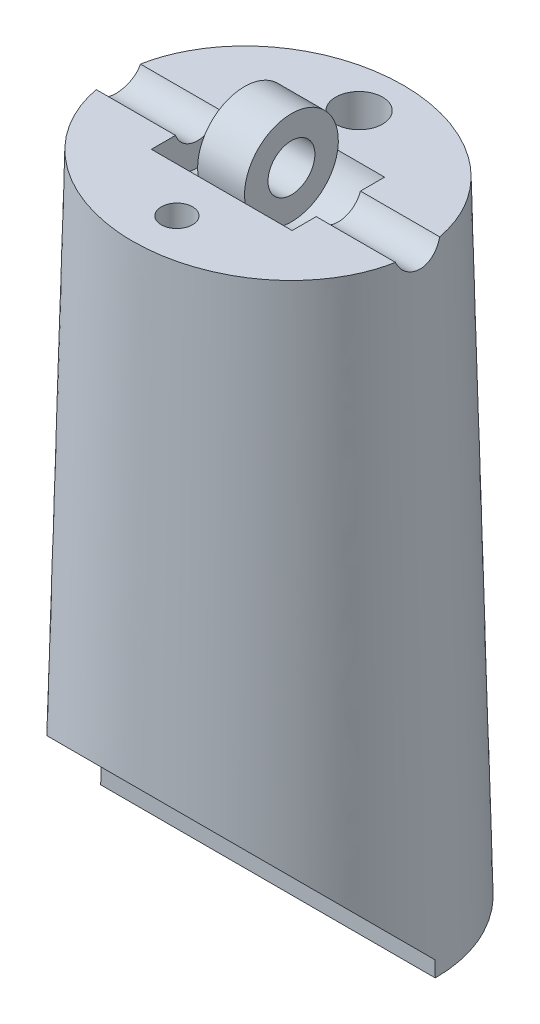
ISO-10303-21;
HEADER;
FILE_DESCRIPTION(('STEP AP214'),'2;1');
FILE_NAME('part.step','',(''),(''),'','','');
FILE_SCHEMA(('AUTOMOTIVE_DESIGN { 1 0 10303 214 1 1 1 1 }'));
ENDSEC;
DATA;
#1=APPLICATION_CONTEXT('core data for automotive mechanical design processes');
#2=APPLICATION_PROTOCOL_DEFINITION('international standard','automotive_design',2000,#1);
#3=PRODUCT_CONTEXT('',#1,'mechanical');
#4=PRODUCT('Part','Part','',(#3));
#5=PRODUCT_RELATED_PRODUCT_CATEGORY('part','',(#4));
#6=PRODUCT_DEFINITION_FORMATION('','',#4);
#7=PRODUCT_DEFINITION_CONTEXT('part definition',#1,'design');
#8=PRODUCT_DEFINITION('design','',#6,#7);
#9=PRODUCT_DEFINITION_SHAPE('','',#8);
#10=(LENGTH_UNIT() NAMED_UNIT(*) SI_UNIT(.MILLI.,.METRE.));
#11=(NAMED_UNIT(*) PLANE_ANGLE_UNIT() SI_UNIT($,.RADIAN.));
#12=(NAMED_UNIT(*) SI_UNIT($,.STERADIAN.) SOLID_ANGLE_UNIT());
#13=UNCERTAINTY_MEASURE_WITH_UNIT(LENGTH_MEASURE(1.E-05),#10,'distance_accuracy_value','');
#14=(GEOMETRIC_REPRESENTATION_CONTEXT(3) GLOBAL_UNCERTAINTY_ASSIGNED_CONTEXT((#13)) GLOBAL_UNIT_ASSIGNED_CONTEXT((#10,
#11,#12)) REPRESENTATION_CONTEXT('',''));
#15=CARTESIAN_POINT('',(0.,0.,0.));
#16=DIRECTION('',(0.,0.,1.));
#17=DIRECTION('',(1.,0.,0.));
#18=AXIS2_PLACEMENT_3D('',#15,#16,#17);
#19=CARTESIAN_POINT('',(-9.69997278667809,39.78,-0.0204755924832029));
#20=DIRECTION('',(0.,-1.,0.));
#21=DIRECTION('',(0.,0.,-1.));
#22=AXIS2_PLACEMENT_3D('',#19,#20,#21);
#23=PLANE('',#22);
#24=CARTESIAN_POINT('',(0.,39.78,-5.82541717924087));
#25=DIRECTION('',(0.,-1.,0.));
#26=DIRECTION('',(0.,0.,-1.));
#27=AXIS2_PLACEMENT_3D('',#24,#25,#26);
#28=CIRCLE('',#27,1.49999999999533);
#29=CARTESIAN_POINT('',(0.,39.78,-7.3254171792362));
#30=VERTEX_POINT('',#29);
#31=EDGE_CURVE('E192',#30,#30,#28,.T.);
#32=ORIENTED_EDGE('',*,*,#31,.T.);
#33=EDGE_LOOP('',(#32));
#34=FACE_BOUND('',#33,.T.);
#35=CARTESIAN_POINT('',(9.7,39.78,0.));
#36=CARTESIAN_POINT('',(9.7,39.78,-0.607159440699071));
#37=CARTESIAN_POINT('',(9.62901456158263,39.78,-1.20197867709866));
#38=CARTESIAN_POINT('',(9.35281328242083,39.78,-2.36828235582108));
#39=CARTESIAN_POINT('',(9.14393105379903,39.78,-2.94405724397895));
#40=CARTESIAN_POINT('',(8.61317817885867,39.78,-4.01939303845332));
#41=CARTESIAN_POINT('',(8.28973157394921,39.78,-4.52688748928126));
#42=CARTESIAN_POINT('',(7.53593732513383,39.78,-5.47497779289229));
#43=CARTESIAN_POINT('',(7.11598726016859,39.78,-5.90313660877463));
#44=CARTESIAN_POINT('',(6.19780810542473,39.78,-6.67602352519654));
#45=CARTESIAN_POINT('',(5.69525783199464,39.78,-7.02218277466077));
#46=CARTESIAN_POINT('',(4.64945242996743,39.78,-7.61046211998648));
#47=CARTESIAN_POINT('',(4.10314659087273,39.78,-7.85605236782765));
#48=CARTESIAN_POINT('',(3.24977658672502,39.78,-8.1540894188394));
#49=CARTESIAN_POINT('',(2.95895196018196,39.78,-8.24168555397149));
#50=CARTESIAN_POINT('',(2.37606742093313,39.78,-8.39052339138916));
#51=CARTESIAN_POINT('',(2.08283826579517,39.78,-8.45223782111557));
#52=CARTESIAN_POINT('',(1.19794805651632,39.78,-8.60039037887436));
#53=CARTESIAN_POINT('',(0.601128224964205,39.78,-8.65015037040227));
#54=CARTESIAN_POINT('',(-0.304631427283031,39.78,-8.64992430723041));
#55=CARTESIAN_POINT('',(-0.607093613947095,39.78,-8.63717771394734));
#56=CARTESIAN_POINT('',(-1.20500675710592,39.78,-8.58709501932377));
#57=CARTESIAN_POINT('',(-1.50165146853973,39.78,-8.54977161598853));
#58=CARTESIAN_POINT('',(-2.38470198810894,39.78,-8.40123131243838));
#59=CARTESIAN_POINT('',(-2.96428938604744,39.78,-8.25379072620645));
#60=CARTESIAN_POINT('',(-3.81910612951762,39.78,-7.95525483556849));
#61=CARTESIAN_POINT('',(-4.1006346804479,39.78,-7.84293661310633));
#62=CARTESIAN_POINT('',(-4.64736711790992,39.78,-7.59640393741084));
#63=CARTESIAN_POINT('',(-4.91394213068515,39.78,-7.46173513235221));
#64=CARTESIAN_POINT('',(-5.69314279355646,39.78,-7.02326819283547));
#65=CARTESIAN_POINT('',(-6.18547459559866,39.78,-6.68539659064221));
#66=CARTESIAN_POINT('',(-6.87901282676226,39.78,-6.10310201946289));
#67=CARTESIAN_POINT('',(-7.10188230947366,39.78,-5.89667642356503));
#68=CARTESIAN_POINT('',(-7.52112811136849,39.78,-5.46774551262105));
#69=CARTESIAN_POINT('',(-7.7189059166298,39.78,-5.24411411879227));
#70=CARTESIAN_POINT('',(-8.27619735025563,39.78,-4.54533003287013));
#71=CARTESIAN_POINT('',(-8.60035159274911,39.78,-4.042227039806));
#72=CARTESIAN_POINT('',(-9.1402754055754,39.78,-2.95452215644732));
#73=CARTESIAN_POINT('',(-9.34505580034182,39.78,-2.39204868574224));
#74=CARTESIAN_POINT('',(-9.55459099949864,39.78,-1.52044603839373));
#75=CARTESIAN_POINT('',(-9.60804009457133,39.78,-1.22522782787052));
#76=CARTESIAN_POINT('',(-9.68054245860291,39.78,-0.624965220529123));
#77=CARTESIAN_POINT('',(-9.69917405598519,39.78,-0.320961902647005));
#78=CARTESIAN_POINT('',(-9.7015702480639,39.78,0.580497027844317));
#79=CARTESIAN_POINT('',(-9.63357573165448,39.78,1.17565953731144));
#80=CARTESIAN_POINT('',(-9.42669737747539,39.78,2.05964650691672));
#81=CARTESIAN_POINT('',(-9.34025340815637,39.78,2.35124696611106));
#82=CARTESIAN_POINT('',(-9.13709128773802,39.78,2.91723965709992));
#83=CARTESIAN_POINT('',(-9.01999654297362,39.78,3.19334920330988));
#84=CARTESIAN_POINT('',(-8.62362226785369,39.78,4.00166157437949));
#85=CARTESIAN_POINT('',(-8.29524348567641,39.78,4.51831673331627));
#86=CARTESIAN_POINT('',(-7.54862795179781,39.78,5.46061475977124));
#87=CARTESIAN_POINT('',(-7.12954425770175,39.78,5.89062769344697));
#88=CARTESIAN_POINT('',(-6.20385774161518,39.78,6.67200537099697));
#89=CARTESIAN_POINT('',(-5.70720593477507,39.78,7.01445271445264));
#90=CARTESIAN_POINT('',(-4.92376017639681,39.78,7.45664697261703));
#91=CARTESIAN_POINT('',(-4.65572403074124,39.78,7.59238862058813));
#92=CARTESIAN_POINT('',(-4.10599550467978,39.78,7.84076023899893));
#93=CARTESIAN_POINT('',(-3.82349694620556,39.78,7.95355917605039));
#94=CARTESIAN_POINT('',(-2.97039740722374,39.78,8.25197777807319));
#95=CARTESIAN_POINT('',(-2.38996364367188,39.78,8.40021291137633));
#96=CARTESIAN_POINT('',(-1.20667775144392,39.78,8.59952274077394));
#97=CARTESIAN_POINT('',(-0.598787675615423,39.78,8.65009359561955));
#98=CARTESIAN_POINT('',(0.602179222537436,39.78,8.64990613969141));
#99=CARTESIAN_POINT('',(1.19803984604725,39.78,8.60045395448393));
#100=CARTESIAN_POINT('',(2.38046818175263,39.78,8.40232806701876));
#101=CARTESIAN_POINT('',(2.9720391155089,39.78,8.25134700371286));
#102=CARTESIAN_POINT('',(4.10447211107018,39.78,7.85532902885435));
#103=CARTESIAN_POINT('',(4.64888524619611,39.78,7.61064053847575));
#104=CARTESIAN_POINT('',(5.43143136650409,39.78,7.17065860170184));
#105=CARTESIAN_POINT('',(5.68656535793043,39.78,7.01176314279567));
#106=CARTESIAN_POINT('',(6.18465958255917,39.78,6.66790904418373));
#107=CARTESIAN_POINT('',(6.42570501472497,39.78,6.48409530614127));
#108=CARTESIAN_POINT('',(7.11417588177828,39.78,5.9048475369739));
#109=CARTESIAN_POINT('',(7.53168982468785,39.78,5.47893170259002));
#110=CARTESIAN_POINT('',(8.27842821218958,39.78,4.54246414832804));
#111=CARTESIAN_POINT('',(8.60954379207821,39.78,4.02549730503949));
#112=CARTESIAN_POINT('',(9.14084585739863,39.78,2.95155139770621));
#113=CARTESIAN_POINT('',(9.34613455820511,39.78,2.39027339992872));
#114=CARTESIAN_POINT('',(9.5569494434953,39.78,1.50925153050235));
#115=CARTESIAN_POINT('',(9.61073462885349,39.78,1.2084910254424));
#116=CARTESIAN_POINT('',(9.68202307962184,39.78,0.606802144307039));
#117=CARTESIAN_POINT('',(9.7,39.78,0.303579720349537));
#118=CARTESIAN_POINT('',(9.7,39.78,0.));
#119=B_SPLINE_CURVE_WITH_KNOTS('',3,(#35,#36,#37,#38,#39,#40,#41,#42,#43,#44,#45,#46,#47,#48,
#49,#50,#51,#52,#53,#54,#55,#56,#57,#58,#59,#60,#61,#62,#63,#64,#65,#66,#67,#68,#69,#70,#71,#72,
#73,#74,#75,#76,#77,#78,#79,#80,#81,#82,#83,#84,#85,#86,#87,#88,#89,#90,#91,#92,#93,#94,#95,#96,
#97,#98,#99,#100,#101,#102,#103,#104,#105,#106,#107,#108,#109,#110,#111,#112,#113,#114,#115,
#116,#117,#118),.UNSPECIFIED.,.T.,.F.,(4,2,2,2,2,2,2,2,2,2,2,2,2,2,2,2,2,2,2,2,2,2,2,2,2,2,2,2,
2,2,2,2,2,2,2,2,2,2,2,2,2,4),(0.,0.03125,0.0625,0.0937499999999999,0.125,0.15625,0.1875,
0.203125,0.21875,0.25,0.265625,0.28125,0.3125,0.328124999999999,0.343749999999999,
0.374999999999999,0.390624999999999,0.406249999999999,0.4375,0.46875,0.484375,0.5,0.53125,
0.546875,0.5625,0.59375,0.625,0.65625,0.671875,0.6875,0.71875,0.75,0.78125,0.8125,0.84375,
0.859375,0.875,0.90625,0.9375,0.96875,0.984375,1.),.UNSPECIFIED.);
#120=CARTESIAN_POINT('',(9.57018395648684,39.78,-1.41421195428606));
#121=VERTEX_POINT('',#120);
#122=CARTESIAN_POINT('',(-9.57033617782671,39.78,-1.41421254629786));
#123=VERTEX_POINT('',#122);
#124=EDGE_CURVE('E144',#121,#123,#119,.T.);
#125=ORIENTED_EDGE('',*,*,#124,.T.);
#126=DIRECTION('',(1.,0.,0.));
#127=VECTOR('',#126,1.);
#128=CARTESIAN_POINT('',(-11.6757220602248,39.78,-1.41421356237312));
#129=LINE('',#128,#127);
#130=CARTESIAN_POINT('',(-4.5,39.78,-1.41421356237312));
#131=VERTEX_POINT('',#130);
#132=EDGE_CURVE('E133',#123,#131,#129,.T.);
#133=ORIENTED_EDGE('',*,*,#132,.T.);
#134=DIRECTION('',(0.,0.,-1.));
#135=VECTOR('',#134,1.);
#136=CARTESIAN_POINT('',(-4.5,39.78,-0.0204755924832029));
#137=LINE('',#136,#135);
#138=CARTESIAN_POINT('',(-4.5,39.78,-2.95803989154982));
#139=VERTEX_POINT('',#138);
#140=EDGE_CURVE('E141',#131,#139,#137,.T.);
#141=ORIENTED_EDGE('',*,*,#140,.T.);
#142=DIRECTION('',(1.,0.,0.));
#143=VECTOR('',#142,1.);
#144=CARTESIAN_POINT('',(-4.5,39.78,-2.95803989154982));
#145=LINE('',#144,#143);
#146=CARTESIAN_POINT('',(-1.5,39.78,-2.95803989154982));
#147=VERTEX_POINT('',#146);
#148=EDGE_CURVE('E259',#139,#147,#145,.T.);
#149=ORIENTED_EDGE('',*,*,#148,.T.);
#150=DIRECTION('',(-1.,0.,0.));
#151=VECTOR('',#150,1.);
#152=CARTESIAN_POINT('',(1.5,39.78,-2.95803989154982));
#153=LINE('',#152,#151);
#154=CARTESIAN_POINT('',(1.5,39.78,-2.95803989154982));
#155=VERTEX_POINT('',#154);
#156=EDGE_CURVE('E352',#155,#147,#153,.T.);
#157=ORIENTED_EDGE('',*,*,#156,.F.);
#158=DIRECTION('',(-1.,0.,0.));
#159=VECTOR('',#158,1.);
#160=CARTESIAN_POINT('',(4.5,39.78,-2.95803989154982));
#161=LINE('',#160,#159);
#162=CARTESIAN_POINT('',(4.5,39.78,-2.95803989154982));
#163=VERTEX_POINT('',#162);
#164=EDGE_CURVE('E265',#163,#155,#161,.T.);
#165=ORIENTED_EDGE('',*,*,#164,.F.);
#166=DIRECTION('',(0.,0.,1.));
#167=VECTOR('',#166,1.);
#168=CARTESIAN_POINT('',(4.5,39.78,-0.0204755924832029));
#169=LINE('',#168,#167);
#170=CARTESIAN_POINT('',(4.5,39.78,-1.41421356237312));
#171=VERTEX_POINT('',#170);
#172=EDGE_CURVE('E152',#163,#171,#169,.T.);
#173=ORIENTED_EDGE('',*,*,#172,.T.);
#174=EDGE_CURVE('E73',#171,#121,#129,.T.);
#175=ORIENTED_EDGE('',*,*,#174,.T.);
#176=EDGE_LOOP('',(#125,#133,#141,#149,#157,#165,#173,#175));
#177=FACE_BOUND('',#176,.T.);
#178=ADVANCED_FACE('F55',(#34,#177),#23,.F.);
#179=CARTESIAN_POINT('',(0.,39.78,5.82542988436819));
#180=DIRECTION('',(0.,-1.,0.));
#181=DIRECTION('',(0.,0.,-1.));
#182=AXIS2_PLACEMENT_3D('',#179,#180,#181);
#183=CIRCLE('',#182,1.00000000000555);
#184=CARTESIAN_POINT('',(0.,39.78,4.82542988436264));
#185=VERTEX_POINT('',#184);
#186=EDGE_CURVE('E191',#185,#185,#183,.T.);
#187=ORIENTED_EDGE('',*,*,#186,.T.);
#188=EDGE_LOOP('',(#187));
#189=FACE_BOUND('',#188,.T.);
#190=CARTESIAN_POINT('',(-9.57030531149114,39.78,1.41421233449734));
#191=VERTEX_POINT('',#190);
#192=CARTESIAN_POINT('',(9.57021049858375,39.78,1.4142129517135));
#193=VERTEX_POINT('',#192);
#194=EDGE_CURVE('E165',#191,#193,#119,.T.);
#195=ORIENTED_EDGE('',*,*,#194,.T.);
#196=DIRECTION('',(1.,0.,0.));
#197=VECTOR('',#196,1.);
#198=CARTESIAN_POINT('',(-11.6757220602248,39.78,1.41421356237312));
#199=LINE('',#198,#197);
#200=CARTESIAN_POINT('',(4.5,39.78,1.41421356237312));
#201=VERTEX_POINT('',#200);
#202=EDGE_CURVE('E208',#193,#201,#199,.F.);
#203=ORIENTED_EDGE('',*,*,#202,.T.);
#204=CARTESIAN_POINT('',(4.5,39.78,2.95803989154982));
#205=VERTEX_POINT('',#204);
#206=EDGE_CURVE('E155',#201,#205,#169,.T.);
#207=ORIENTED_EDGE('',*,*,#206,.T.);
#208=DIRECTION('',(-1.,0.,0.));
#209=VECTOR('',#208,1.);
#210=CARTESIAN_POINT('',(4.5,39.78,2.95803989154982));
#211=LINE('',#210,#209);
#212=CARTESIAN_POINT('',(1.5,39.78,2.95803989154982));
#213=VERTEX_POINT('',#212);
#214=EDGE_CURVE('E269',#213,#205,#211,.F.);
#215=ORIENTED_EDGE('',*,*,#214,.F.);
#216=DIRECTION('',(-1.,0.,0.));
#217=VECTOR('',#216,1.);
#218=CARTESIAN_POINT('',(1.5,39.78,2.95803989154982));
#219=LINE('',#218,#217);
#220=CARTESIAN_POINT('',(-1.5,39.78,2.95803989154982));
#221=VERTEX_POINT('',#220);
#222=EDGE_CURVE('E357',#221,#213,#219,.F.);
#223=ORIENTED_EDGE('',*,*,#222,.F.);
#224=DIRECTION('',(1.,0.,0.));
#225=VECTOR('',#224,1.);
#226=CARTESIAN_POINT('',(-4.5,39.78,2.95803989154982));
#227=LINE('',#226,#225);
#228=CARTESIAN_POINT('',(-4.5,39.78,2.95803989154982));
#229=VERTEX_POINT('',#228);
#230=EDGE_CURVE('E255',#221,#229,#227,.F.);
#231=ORIENTED_EDGE('',*,*,#230,.T.);
#232=CARTESIAN_POINT('',(-4.5,39.78,1.41421356237312));
#233=VERTEX_POINT('',#232);
#234=EDGE_CURVE('E65',#229,#233,#137,.T.);
#235=ORIENTED_EDGE('',*,*,#234,.T.);
#236=EDGE_CURVE('E81',#233,#191,#199,.F.);
#237=ORIENTED_EDGE('',*,*,#236,.T.);
#238=EDGE_LOOP('',(#195,#203,#207,#215,#223,#231,#235,#237));
#239=FACE_BOUND('',#238,.T.);
#240=ADVANCED_FACE('F57',(#189,#239),#23,.F.);
#241=CARTESIAN_POINT('',(0.,0.,0.));
#242=DIRECTION('',(0.,1.,0.));
#243=DIRECTION('',(0.,0.,1.));
#244=AXIS2_PLACEMENT_3D('',#241,#242,#243);
#245=PLANE('',#244);
#246=CARTESIAN_POINT('',(0.,0.,-5.82541717924087));
#247=DIRECTION('',(0.,1.,0.));
#248=DIRECTION('',(0.,0.,1.));
#249=AXIS2_PLACEMENT_3D('',#246,#247,#248);
#250=CIRCLE('',#249,1.49999999999533);
#251=CARTESIAN_POINT('',(0.,0.,-4.32541717924554));
#252=VERTEX_POINT('',#251);
#253=EDGE_CURVE('E60',#252,#252,#250,.T.);
#254=ORIENTED_EDGE('',*,*,#253,.T.);
#255=EDGE_LOOP('',(#254));
#256=FACE_BOUND('',#255,.T.);
#257=CARTESIAN_POINT('',(0.,0.,0.));
#258=DIRECTION('',(0.,1.,0.));
#259=DIRECTION('',(-1.,0.,0.));
#260=AXIS2_PLACEMENT_3D('',#257,#258,#259);
#261=ELLIPSE('',#260,10.7,9.65);
#262=CARTESIAN_POINT('',(10.7,0.,0.));
#263=VERTEX_POINT('',#262);
#264=CARTESIAN_POINT('',(-10.6999775050333,0.,0.));
#265=VERTEX_POINT('',#264);
#266=EDGE_CURVE('E282',#263,#265,#261,.T.);
#267=ORIENTED_EDGE('',*,*,#266,.F.);
#268=DIRECTION('',(1.,0.,0.));
#269=VECTOR('',#268,1.);
#270=CARTESIAN_POINT('',(-10.7325677947644,0.,0.));
#271=LINE('',#270,#269);
#272=EDGE_CURVE('E276',#265,#263,#271,.T.);
#273=ORIENTED_EDGE('',*,*,#272,.F.);
#274=EDGE_LOOP('',(#267,#273));
#275=FACE_BOUND('',#274,.T.);
#276=ADVANCED_FACE('F317',(#256,#275),#245,.F.);
#277=CARTESIAN_POINT('',(10.7,0.,0.));
#278=CARTESIAN_POINT('',(10.3666666666667,13.26,0.));
#279=CARTESIAN_POINT('',(10.0333333333333,26.52,0.));
#280=CARTESIAN_POINT('',(9.7,39.78,0.));
#281=CARTESIAN_POINT('',(10.7,0.,-0.133149496143948));
#282=CARTESIAN_POINT('',(10.3666666666667,13.26,-0.129243626809237));
#283=CARTESIAN_POINT('',(10.0333333333333,26.52,-0.125337757474526));
#284=CARTESIAN_POINT('',(9.7,39.78,-0.121431888139815));
#285=CARTESIAN_POINT('',(10.6850339754808,0.,-0.795765957556547));
#286=CARTESIAN_POINT('',(10.3518742462701,13.26,-0.772942133277592));
#287=CARTESIAN_POINT('',(10.0187145170595,26.52,-0.750118308998638));
#288=CARTESIAN_POINT('',(9.68555478784876,39.78,-0.727294484719684));
#289=CARTESIAN_POINT('',(10.5082373102143,0.,-2.08709281613432));
#290=CARTESIAN_POINT('',(10.1769985490636,13.26,-2.03199631843026));
#291=CARTESIAN_POINT('',(9.84575978791299,26.52,-1.9768998207262));
#292=CARTESIAN_POINT('',(9.51452102676236,39.78,-1.92180332302213));
#293=CARTESIAN_POINT('',(9.91880308589645,0.,-3.78334075478543));
#294=CARTESIAN_POINT('',(9.59258375813361,13.26,-3.69153100741009));
#295=CARTESIAN_POINT('',(9.26636443037076,26.52,-3.59972126003476));
#296=CARTESIAN_POINT('',(8.94014510260791,39.78,-3.50791151265942));
#297=CARTESIAN_POINT('',(8.92549712496752,0.,-5.4289633608716));
#298=CARTESIAN_POINT('',(8.60388125132587,13.26,-5.29963237754103));
#299=CARTESIAN_POINT('',(8.28226537768422,26.52,-5.17030139421047));
#300=CARTESIAN_POINT('',(7.96064950404257,39.78,-5.0409704108799));
#301=CARTESIAN_POINT('',(7.60935087987244,0.,-6.8638432916675));
#302=CARTESIAN_POINT('',(7.30416897063055,13.26,-6.68734775270384));
#303=CARTESIAN_POINT('',(6.99898706138867,26.52,-6.51085221374017));
#304=CARTESIAN_POINT('',(6.69380515214678,39.7800000000001,-6.33435667477651));
#305=CARTESIAN_POINT('',(6.02230208010248,0.,-8.04910469893778));
#306=CARTESIAN_POINT('',(5.74804961400774,13.26,-7.82070216719233));
#307=CARTESIAN_POINT('',(5.473797147913,26.5199999999999,-7.59229963544688));
#308=CARTESIAN_POINT('',(5.19954468181826,39.7799999999999,-7.36389710370143));
#309=CARTESIAN_POINT('',(4.19011385362072,0.,-8.94570944777782));
#310=CARTESIAN_POINT('',(3.97673931553582,13.26,-8.66516079006637));
#311=CARTESIAN_POINT('',(3.76336477745092,26.5200000000001,-8.38461213235491));
#312=CARTESIAN_POINT('',(3.54999023936603,39.7800000000001,-8.10406347464346));
#313=CARTESIAN_POINT('',(2.1883468593346,0.,-9.51492368172717));
#314=CARTESIAN_POINT('',(2.05817251801201,13.26,-9.19353216243719));
#315=CARTESIAN_POINT('',(1.92799817668942,26.52,-8.87214064314721));
#316=CARTESIAN_POINT('',(1.79782383536683,39.78,-8.55074912385723));
#317=CARTESIAN_POINT('',(4.13105510519915E-07,0.,-9.71747770660494));
#318=CARTESIAN_POINT('',(-0.00147742715764649,13.26,-9.37846436779292));
#319=CARTESIAN_POINT('',(-0.00295526742080351,26.5199999999999,-9.0394510289809));
#320=CARTESIAN_POINT('',(-0.00443310768396052,39.7799999999999,-8.70043769016888));
#321=CARTESIAN_POINT('',(-2.18834788826033,0.,-9.51503703788185));
#322=CARTESIAN_POINT('',(-2.06031831460388,13.26,-9.19322896272273));
#323=CARTESIAN_POINT('',(-1.93228874094743,26.52,-8.87142088756362));
#324=CARTESIAN_POINT('',(-1.80425916729098,39.78,-8.54961281240451));
#325=CARTESIAN_POINT('',(-4.19011185577917,0.,-8.94535782876045));
#326=CARTESIAN_POINT('',(-3.97752805344192,13.26,-8.66442321683007));
#327=CARTESIAN_POINT('',(-3.76494425110467,26.52,-8.3834886048997));
#328=CARTESIAN_POINT('',(-3.55236044876742,39.7800000000001,-8.10255399296932));
#329=CARTESIAN_POINT('',(-6.02230581120232,0.,-8.04984068401496));
#330=CARTESIAN_POINT('',(-5.74801822661037,13.26,-7.82107403409948));
#331=CARTESIAN_POINT('',(-5.47373064201842,26.52,-7.592307384184));
#332=CARTESIAN_POINT('',(-5.19944305742647,39.7800000000001,-7.36354073426852));
#333=CARTESIAN_POINT('',(-7.60934397892386,0.,-6.86243909399851));
#334=CARTESIAN_POINT('',(-7.3015246242125,13.26,-6.68905289919875));
#335=CARTESIAN_POINT('',(-6.99370526950114,26.52,-6.51566670439899));
#336=CARTESIAN_POINT('',(-6.68588591478977,39.78,-6.34228050959924));
#337=CARTESIAN_POINT('',(-8.92550946274477,0.,-5.43149116554386));
#338=CARTESIAN_POINT('',(-8.60102895595618,13.26,-5.30382104111544));
#339=CARTESIAN_POINT('',(-8.27654844916758,26.52,-5.17615091668703));
#340=CARTESIAN_POINT('',(-7.95206794237899,39.78,-5.04848079225861));
#341=CARTESIAN_POINT('',(-9.91878392909196,0.,-3.77944128187365));
#342=CARTESIAN_POINT('',(-9.58925317137216,13.26,-3.69563137812103));
#343=CARTESIAN_POINT('',(-9.25972241365235,26.52,-3.6118214743684));
#344=CARTESIAN_POINT('',(-8.93019165593255,39.78,-3.52801157061578));
#345=CARTESIAN_POINT('',(-10.5503760824631,0.,-1.97309236680673));
#346=CARTESIAN_POINT('',(-10.2177372453717,13.26,-1.92430918888444));
#347=CARTESIAN_POINT('',(-9.88509840828031,26.52,-1.87552601096216));
#348=CARTESIAN_POINT('',(-9.55245957118889,39.78,-1.82674283303987));
#349=CARTESIAN_POINT('',(-10.7747444738684,0.,0.));
#350=CARTESIAN_POINT('',(-10.4402065819833,13.26,-0.00771649125251276));
#351=CARTESIAN_POINT('',(-10.1056686900981,26.52,-0.0154329825050225));
#352=CARTESIAN_POINT('',(-9.77113079821297,39.78,-0.0231494737575322));
#353=CARTESIAN_POINT('',(-10.5503760824631,0.,1.97309236680672));
#354=CARTESIAN_POINT('',(-10.2213446785231,13.26,1.90913210068818));
#355=CARTESIAN_POINT('',(-9.89231327458305,26.52,1.84517183456965));
#356=CARTESIAN_POINT('',(-9.563281870643,39.78,1.78121156845111));
#357=CARTESIAN_POINT('',(-9.918783929092,0.,3.77944128187365));
#358=CARTESIAN_POINT('',(-9.59499435726363,13.26,3.68471658196975));
#359=CARTESIAN_POINT('',(-9.27120478543525,26.52,3.58999188206585));
#360=CARTESIAN_POINT('',(-8.94741521360688,39.78,3.49526718216195));
#361=CARTESIAN_POINT('',(-8.92550946274474,0.,5.43149116554385));
#362=CARTESIAN_POINT('',(-8.60748362282506,13.26,5.29610632615772));
#363=CARTESIAN_POINT('',(-8.28945778290539,26.52,5.16072148677158));
#364=CARTESIAN_POINT('',(-7.97143194298572,39.78,5.02533664738545));
#365=CARTESIAN_POINT('',(-7.60934397892389,0.,6.86243909399851));
#366=CARTESIAN_POINT('',(-7.30738897945922,13.26,6.68406128661425));
#367=CARTESIAN_POINT('',(-7.00543397999454,26.52,6.50568347923));
#368=CARTESIAN_POINT('',(-6.70347898052987,39.78,6.32730567184574));
#369=CARTESIAN_POINT('',(-6.0223058112023,0.,8.04984068401495));
#370=CARTESIAN_POINT('',(-5.75210495679809,13.26,7.81891377709896));
#371=CARTESIAN_POINT('',(-5.48190410239388,26.52,7.58798687018296));
#372=CARTESIAN_POINT('',(-5.21170324798967,39.78,7.35705996326697));
#373=CARTESIAN_POINT('',(-4.1901118557792,0.,8.94535782876046));
#374=CARTESIAN_POINT('',(-3.97937929217595,13.26,8.66425288524495));
#375=CARTESIAN_POINT('',(-3.7686467285727,26.52,8.38314794172943));
#376=CARTESIAN_POINT('',(-3.55791416496946,39.7800000000001,8.10204299821392));
#377=CARTESIAN_POINT('',(-2.18834788826033,0.,9.51503703788184));
#378=CARTESIAN_POINT('',(-2.0602056425314,13.26,9.19325744300502));
#379=CARTESIAN_POINT('',(-1.93206339680247,26.52,8.8714778481282));
#380=CARTESIAN_POINT('',(-1.80392115107354,39.78,8.54969825325138));
#381=CARTESIAN_POINT('',(4.13105500978936E-07,0.,9.71747770660495));
#382=CARTESIAN_POINT('',(-0.000238834548613382,13.26,9.3781410872248));
#383=CARTESIAN_POINT('',(-0.000478082202727743,26.52,9.03880446784466));
#384=CARTESIAN_POINT('',(-0.000717329856842104,39.78,8.69946784846452));
#385=CARTESIAN_POINT('',(2.1883468593346,0.,9.51492368172718));
#386=CARTESIAN_POINT('',(2.05913263126498,13.26,9.19354708913096));
#387=CARTESIAN_POINT('',(1.92991840319536,26.52,8.87217049653474));
#388=CARTESIAN_POINT('',(1.80070417512573,39.78,8.55079390393852));
#389=CARTESIAN_POINT('',(4.1901138536207,0.,8.94570944777781));
#390=CARTESIAN_POINT('',(3.97714323622086,13.26,8.66528633374939));
#391=CARTESIAN_POINT('',(3.76417261882102,26.52,8.38486321972096));
#392=CARTESIAN_POINT('',(3.55120200142117,39.78,8.10444010569254));
#393=CARTESIAN_POINT('',(6.02230208010248,0.,8.04910469893779));
#394=CARTESIAN_POINT('',(5.74874631559381,13.26,7.81979317920711));
#395=CARTESIAN_POINT('',(5.47519055108514,26.52,7.59048165947642));
#396=CARTESIAN_POINT('',(5.20163478657647,39.78,7.36117013974574));
#397=CARTESIAN_POINT('',(7.60935087987245,0.,6.8638432916675));
#398=CARTESIAN_POINT('',(7.3028440458543,13.26,6.68841739440262));
#399=CARTESIAN_POINT('',(6.99633721183615,26.52,6.51299149713775));
#400=CARTESIAN_POINT('',(6.689830377818,39.78,6.33756559987288));
#401=CARTESIAN_POINT('',(8.9254971249675,0.,5.4289633608716));
#402=CARTESIAN_POINT('',(8.60153695743572,13.26,5.30271160053064));
#403=CARTESIAN_POINT('',(8.27757678990393,26.52,5.17645984018968));
#404=CARTESIAN_POINT('',(7.95361662237215,39.7799999999999,5.05020807984872));
#405=CARTESIAN_POINT('',(9.91880308589648,0.,3.78334075478543));
#406=CARTESIAN_POINT('',(9.59092490190203,13.26,3.69406984147218));
#407=CARTESIAN_POINT('',(9.26304671790758,26.5200000000001,3.60479892815893));
#408=CARTESIAN_POINT('',(8.93516853391313,39.7800000000001,3.51552801484569));
#409=CARTESIAN_POINT('',(10.5082373102142,0.,2.08709281613432));
#410=CARTESIAN_POINT('',(10.176104417257,13.26,2.03730692650762));
#411=CARTESIAN_POINT('',(9.84397152429979,26.5199999999999,1.98752103688092));
#412=CARTESIAN_POINT('',(9.51183863134257,39.7799999999999,1.93773514725423));
#413=CARTESIAN_POINT('',(10.6850339754808,0.,0.795765957556549));
#414=CARTESIAN_POINT('',(10.3517902954068,13.26,0.773492992471153));
#415=CARTESIAN_POINT('',(10.0185466153328,26.52,0.751220027385758));
#416=CARTESIAN_POINT('',(9.68530293525875,39.78,0.728947062300363));
#417=CARTESIAN_POINT('',(10.7,0.,0.13314949614395));
#418=CARTESIAN_POINT('',(10.3666666666667,13.26,0.129243626809238));
#419=CARTESIAN_POINT('',(10.0333333333333,26.52,0.125337757474526));
#420=CARTESIAN_POINT('',(9.7,39.78,0.121431888139815));
#421=CARTESIAN_POINT('',(10.7,0.,0.));
#422=CARTESIAN_POINT('',(10.3666666666667,13.26,0.));
#423=CARTESIAN_POINT('',(10.0333333333333,26.52,0.));
#424=CARTESIAN_POINT('',(9.7,39.78,0.));
#425=B_SPLINE_SURFACE_WITH_KNOTS('',3,3,((#277,#278,#279,#280),(#281,#282,#283,#284),(#285,#286,
#287,#288),(#289,#290,#291,#292),(#293,#294,#295,#296),(#297,#298,#299,#300),(#301,#302,#303,
#304),(#305,#306,#307,#308),(#309,#310,#311,#312),(#313,#314,#315,#316),(#317,#318,#319,#320),
(#321,#322,#323,#324),(#325,#326,#327,#328),(#329,#330,#331,#332),(#333,#334,#335,#336),(#337,
#338,#339,#340),(#341,#342,#343,#344),(#345,#346,#347,#348),(#349,#350,#351,#352),(#353,#354,
#355,#356),(#357,#358,#359,#360),(#361,#362,#363,#364),(#365,#366,#367,#368),(#369,#370,#371,
#372),(#373,#374,#375,#376),(#377,#378,#379,#380),(#381,#382,#383,#384),(#385,#386,#387,#388),
(#389,#390,#391,#392),(#393,#394,#395,#396),(#397,#398,#399,#400),(#401,#402,#403,#404),(#405,
#406,#407,#408),(#409,#410,#411,#412),(#413,#414,#415,#416),(#417,#418,#419,#420),(#421,#422,
#423,#424)),.UNSPECIFIED.,.T.,.F.,.F.,(4,1,1,1,1,1,1,1,1,1,1,1,1,1,1,1,1,1,1,1,1,1,1,1,1,1,1,1,
1,1,1,1,1,1,4),(4,4),(0.,0.00625000000000009,0.03125,0.0625,0.09375,0.125,0.15625,0.1875,
0.21875,0.25,0.28125,0.3125,0.34375,0.375,0.40625,0.4375,0.46875,0.5,0.53125,0.5625,0.59375,
0.625,0.65625,0.6875,0.71875,0.75,0.78125,0.8125,0.84375,0.875,0.90625,0.9375,0.96875,0.99375,
1.),(0.,1.),.UNSPECIFIED.);
#426=CARTESIAN_POINT('',(9.56897455753915,39.78,1.41421356237311));
#427=CARTESIAN_POINT('',(9.57262193343638,39.7399849342098,1.40006567210318));
#428=CARTESIAN_POINT('',(9.57652699908907,39.7006120431673,1.38423397241259));
#429=CARTESIAN_POINT('',(9.58475577820204,39.6233874742425,1.3493173453074));
#430=CARTESIAN_POINT('',(9.5890794389302,39.5855356055988,1.33023282743383));
#431=CARTESIAN_POINT('',(9.60252038069465,39.4747202611801,1.26833174570381));
#432=CARTESIAN_POINT('',(9.61211991870515,39.4043674360901,1.22082161403732));
#433=CARTESIAN_POINT('',(9.63166300670526,39.2727136690425,1.11469041515137));
#434=CARTESIAN_POINT('',(9.6416066063114,39.2114140394019,1.05606773990646));
#435=CARTESIAN_POINT('',(9.66086912362452,39.0995030782517,0.929285173165842));
#436=CARTESIAN_POINT('',(9.67018810807494,39.0488906035163,0.861126303073706));
#437=CARTESIAN_POINT('',(9.68729593080583,38.9596790769043,0.716911523359055));
#438=CARTESIAN_POINT('',(9.69508049310462,38.9211134260811,0.64083442372218));
#439=CARTESIAN_POINT('',(9.70827903604832,38.8573661033263,0.483062311645046));
#440=CARTESIAN_POINT('',(9.7136930619349,38.8321841759645,0.401367406455011));
#441=CARTESIAN_POINT('',(9.72148845635619,38.7963521655659,0.236224212552565));
#442=CARTESIAN_POINT('',(9.72392170032728,38.7854532691694,0.152832379012383));
#443=CARTESIAN_POINT('',(9.72564377804402,38.7777319751986,-0.0146248504587285));
#444=CARTESIAN_POINT('',(9.72493307821604,38.7809074895858,-0.0986901446299307));
#445=CARTESIAN_POINT('',(9.72052178892377,38.8010574266164,-0.263675453496097));
#446=CARTESIAN_POINT('',(9.71686985463424,38.8178073238535,-0.344624364152903));
#447=CARTESIAN_POINT('',(9.70700018973583,38.8642900958079,-0.502533671926502));
#448=CARTESIAN_POINT('',(9.70078243097544,38.8940231129725,-0.579494025271524));
#449=CARTESIAN_POINT('',(9.68633289256708,38.9658867001482,-0.727989622379755));
#450=CARTESIAN_POINT('',(9.67808450750508,39.0081200990232,-0.799473419906273));
#451=CARTESIAN_POINT('',(9.66039827285863,39.103712280671,-0.934445639291302));
#452=CARTESIAN_POINT('',(9.65095988677162,39.1570760886458,-0.997930428886648));
#453=CARTESIAN_POINT('',(9.63158780567178,39.2747326931805,-1.1164975049158));
#454=CARTESIAN_POINT('',(9.62164782426938,39.3392358092463,-1.17136977406044));
#455=CARTESIAN_POINT('',(9.60244636441809,39.4765614865987,-1.26948191783556));
#456=CARTESIAN_POINT('',(9.59318386285858,39.549371059432,-1.312739607886));
#457=CARTESIAN_POINT('',(9.58189824797069,39.6504373294197,-1.36177738119231));
#458=CARTESIAN_POINT('',(9.57917427687201,39.6759464342303,-1.37328235707596));
#459=CARTESIAN_POINT('',(9.57392833454586,39.7275442195936,-1.39483724674983));
#460=CARTESIAN_POINT('',(9.57140604801952,39.753631910694,-1.4048894523808));
#461=CARTESIAN_POINT('',(9.5689945961659,39.78,-1.41421356237312));
#462=B_SPLINE_CURVE_WITH_KNOTS('',3,(#426,#427,#428,#429,#430,#431,#432,#433,#434,#435,#436,
#437,#438,#439,#440,#441,#442,#443,#444,#445,#446,#447,#448,#449,#450,#451,#452,#453,#454,#455,
#456,#457,#458,#459,#460,#461),.UNSPECIFIED.,.F.,.F.,(4,2,2,2,2,2,2,2,2,2,2,2,2,2,2,2,2,4),(0.,
0.127715347914223,0.255414627887842,0.51040422222039,0.76543074267999,1.02042996861874,
1.27613005621842,1.53182526357053,1.78300424473153,2.03414596295755,2.28121648076926,
2.52828970944212,2.77745470661623,3.0267324422624,3.28137004393343,3.53561480025507,
3.61992990286019,3.70411050589632),.UNSPECIFIED.);
#463=EDGE_CURVE('E214',#193,#121,#462,.T.);
#464=CARTESIAN_POINT('',(-9.5693131602318,39.78,-1.41421356237312));
#465=CARTESIAN_POINT('',(-9.5729641990479,39.7399846960434,-1.40006558497599));
#466=CARTESIAN_POINT('',(-9.57687309688283,39.7006116126752,-1.38423379811357));
#467=CARTESIAN_POINT('',(-9.58510929567917,39.623386687344,-1.34931696915166));
#468=CARTESIAN_POINT('',(-9.58943654393019,39.5855346545834,-1.3302323366665));
#469=CARTESIAN_POINT('',(-9.60288707101418,39.474718164163,-1.26833049372626));
#470=CARTESIAN_POINT('',(-9.6124913827609,39.4043643585084,-1.22081953086157));
#471=CARTESIAN_POINT('',(-9.63203576063474,39.2727081886768,-1.11468559878123));
#472=CARTESIAN_POINT('',(-9.64197587546751,39.2114071445193,-1.05606101188392));
#473=CARTESIAN_POINT('',(-9.6612194214099,39.099493564486,-0.929273312710531));
#474=CARTESIAN_POINT('',(-9.67052292361559,39.0488798337437,-0.86111126816269));
#475=CARTESIAN_POINT('',(-9.68758728721281,38.9596700189859,-0.716894498686368));
#476=CARTESIAN_POINT('',(-9.69534396116749,38.9211064003643,-0.640819175526257));
#477=CARTESIAN_POINT('',(-9.70848133582647,38.8573624713506,-0.483051182858035));
#478=CARTESIAN_POINT('',(-9.71386207180191,38.8321819622831,-0.401358596759843));
#479=CARTESIAN_POINT('',(-9.72160114267874,38.7963526464857,-0.236225060740557));
#480=CARTESIAN_POINT('',(-9.72401128540198,38.7854545316178,-0.152840645501674));
#481=CARTESIAN_POINT('',(-9.72571207141179,38.777732190865,0.0146010699795011));
#482=CARTESIAN_POINT('',(-9.72500318533669,38.7809058416556,0.0986582667935037));
#483=CARTESIAN_POINT('',(-9.72058689564905,38.8010520527454,0.263649540272808));
#484=CARTESIAN_POINT('',(-9.71692750986829,38.817803661823,0.344612047970237));
#485=CARTESIAN_POINT('',(-9.70704890982301,38.8642942061399,0.502547511045895));
#486=CARTESIAN_POINT('',(-9.70082966207558,38.8940333112555,0.579520414225415));
#487=CARTESIAN_POINT('',(-9.68638339141487,38.9659091797666,0.728030709354765));
#488=CARTESIAN_POINT('',(-9.67814003925516,39.0081473772803,0.799517355295748));
#489=CARTESIAN_POINT('',(-9.66046861031289,39.1037505754055,0.934494284481322));
#490=CARTESIAN_POINT('',(-9.65104000095738,39.1571205850378,0.997980947244608));
#491=CARTESIAN_POINT('',(-9.63168942493589,39.2747883994606,1.11654783398075));
#492=CARTESIAN_POINT('',(-9.62176121282983,39.3392961522099,1.17141839747673));
#493=CARTESIAN_POINT('',(-9.6025817384946,39.4766307345074,1.26952589326968));
#494=CARTESIAN_POINT('',(-9.59332945556371,39.5494445766983,1.31278064217347));
#495=CARTESIAN_POINT('',(-9.58205691765542,39.6505025044183,1.3618072167372));
#496=CARTESIAN_POINT('',(-9.57933706580073,39.6759990623789,1.37330521297741));
#497=CARTESIAN_POINT('',(-9.57409879294564,39.7275710429497,1.39484758403109));
#498=CARTESIAN_POINT('',(-9.57158005748504,39.7536454770733,1.40489424883532));
#499=CARTESIAN_POINT('',(-9.56917185304843,39.78,1.41421356237313));
#500=B_SPLINE_CURVE_WITH_KNOTS('',3,(#464,#465,#466,#467,#468,#469,#470,#471,#472,#473,#474,
#475,#476,#477,#478,#479,#480,#481,#482,#483,#484,#485,#486,#487,#488,#489,#490,#491,#492,#493,
#494,#495,#496,#497,#498,#499),.UNSPECIFIED.,.F.,.F.,(4,2,2,2,2,2,2,2,2,2,2,2,2,2,2,2,2,4),(0.,
0.127717037119404,0.25541800334736,0.510413032705474,0.765445207278212,1.02044885354477,
1.27613372181469,1.53181479427667,1.78297057777174,2.03408846502108,2.28120009644992,
2.5283149601925,2.77749296636123,3.02678333886704,3.281423946036,3.53567171932498,
3.61994296818437,3.70407976183055),.UNSPECIFIED.);
#501=EDGE_CURVE('E146',#123,#191,#500,.T.);
#502=DIRECTION('',(-0.0251303213575726,0.999684183604235,0.));
#503=VECTOR('',#502,1.);
#504=CARTESIAN_POINT('',(10.2,19.89,0.));
#505=LINE('',#504,#503);
#506=CARTESIAN_POINT('',(10.6748617395676,1.,0.));
#507=VERTEX_POINT('',#506);
#508=EDGE_CURVE('E349',#263,#507,#505,.T.);
#509=CARTESIAN_POINT('',(-10.674819009968,1.,0.));
#510=CARTESIAN_POINT('',(-10.6831976766675,0.666666666666667,0.));
#511=CARTESIAN_POINT('',(-10.6915763433671,0.333333333333334,0.));
#512=CARTESIAN_POINT('',(-10.6999550100666,0.,0.));
#513=B_SPLINE_CURVE_WITH_KNOTS('',3,(#509,#510,#511,#512),.UNSPECIFIED.,.F.,.F.,(4,4),(0.,
1.00031585936691),.UNSPECIFIED.);
#514=CARTESIAN_POINT('',(-10.674819009968,1.,0.));
#515=VERTEX_POINT('',#514);
#516=EDGE_CURVE('E182',#515,#265,#513,.T.);
#517=CARTESIAN_POINT('',(10.6748617395676,1.,0.));
#518=CARTESIAN_POINT('',(10.6664303959697,1.33608480034098,0.336084800340986));
#519=CARTESIAN_POINT('',(10.6388076971348,1.67200438966921,0.672004389669214));
#520=CARTESIAN_POINT('',(10.5443010884223,2.34137613536007,1.34137613536008));
#521=CARTESIAN_POINT('',(10.477380539352,2.67482569462623,1.67482569462625));
#522=CARTESIAN_POINT('',(10.3028483442808,3.338628515513,2.33862851551303));
#523=CARTESIAN_POINT('',(10.1949756825436,3.6689476839751,2.66894768397513));
#524=CARTESIAN_POINT('',(9.9379972917435,4.32136912683666,3.3213691268367));
#525=CARTESIAN_POINT('',(9.78890979584251,4.64347496609177,3.6434749660918));
#526=CARTESIAN_POINT('',(9.48402725879758,5.21121185630705,4.21121185630709));
#527=CARTESIAN_POINT('',(9.33594576819441,5.45892360393878,4.45892360393882));
#528=CARTESIAN_POINT('',(9.01309610522233,5.94553053554589,4.94553053554594));
#529=CARTESIAN_POINT('',(8.83832892258225,6.18442604609329,5.18442604609334));
#530=CARTESIAN_POINT('',(8.46221304630076,6.65076808533754,5.6507680853376));
#531=CARTESIAN_POINT('',(8.26093023593915,6.87824112122662,5.87824112122668));
#532=CARTESIAN_POINT('',(7.83156228530643,7.32014958187496,6.32014958187502));
#533=CARTESIAN_POINT('',(7.60348398512277,7.53458831278592,6.53458831278599));
#534=CARTESIAN_POINT('',(7.16975188615355,7.90596535866005,6.90596535866012));
#535=CARTESIAN_POINT('',(6.96894466163656,8.06573950742242,7.06573950742249));
#536=CARTESIAN_POINT('',(6.55047866806991,8.37385407759747,7.37385407759755));
#537=CARTESIAN_POINT('',(6.33282247856749,8.52219624231482,7.5221962423149));
#538=CARTESIAN_POINT('',(5.88107516936931,8.80562084373807,7.80562084373816));
#539=CARTESIAN_POINT('',(5.64699413337746,8.94071129598565,7.94071129598574));
#540=CARTESIAN_POINT('',(5.16315357550794,9.19608114935507,8.19608114935516));
#541=CARTESIAN_POINT('',(4.91339480034482,9.31636125507152,8.31636125507162));
#542=CARTESIAN_POINT('',(4.44044941637255,9.52264609884199,8.52264609884208));
#543=CARTESIAN_POINT('',(4.21935982049516,9.61105922762606,8.61105922762615));
#544=CARTESIAN_POINT('',(3.76797008367489,9.7751953580745,8.77519535807459));
#545=CARTESIAN_POINT('',(3.53767163083046,9.85092067248392,8.85092067248401));
#546=CARTESIAN_POINT('',(3.06890221317721,9.98837442864218,8.98837442864227));
#547=CARTESIAN_POINT('',(2.83043445337073,10.0501082887723,9.05010828877238));
#548=CARTESIAN_POINT('',(2.46773950737615,10.1314595233393,9.13145952333939));
#549=CARTESIAN_POINT('',(2.34599064786384,10.1567045690956,9.15670456909574));
#550=CARTESIAN_POINT('',(2.10102952625379,10.20335369453,9.20335369453009));
#551=CARTESIAN_POINT('',(1.97781726336774,10.2247577721388,9.22475777213895));
#552=CARTESIAN_POINT('',(1.60544808743669,10.2832890400602,9.2832890400603));
#553=CARTESIAN_POINT('',(1.35439867902139,10.3145467512852,9.31454675128534));
#554=CARTESIAN_POINT('',(0.849364240571681,10.3611996307226,9.36119963072268));
#555=CARTESIAN_POINT('',(0.595379220985233,10.3765948553725,9.37659485537261));
#556=CARTESIAN_POINT('',(0.213758096342449,10.3875158202543,9.38751582025442));
#557=CARTESIAN_POINT('',(0.0864260054667934,10.3891268726652,9.38912687266533));
#558=CARTESIAN_POINT('',(-0.168209068031657,10.3882453191601,9.38824531916018));
#559=CARTESIAN_POINT('',(-0.295512050499664,10.3857526919074,9.38575269190746));
#560=CARTESIAN_POINT('',(-0.67698011221996,10.3722043210827,9.37220432108275));
#561=CARTESIAN_POINT('',(-0.930765591134957,10.3550798063253,9.35507980632544));
#562=CARTESIAN_POINT('',(-1.42033878831182,10.3064819817383,9.30648198173836));
#563=CARTESIAN_POINT('',(-1.65630874049161,10.2759096308461,9.27590963084619));
#564=CARTESIAN_POINT('',(-2.1237486293551,10.200888915494,9.20088891549405));
#565=CARTESIAN_POINT('',(-2.35521966324717,10.1564439805941,9.15644398059416));
#566=CARTESIAN_POINT('',(-2.81207504068535,10.0541804967701,9.05418049677015));
#567=CARTESIAN_POINT('',(-3.03746131666536,9.99636625090188,8.99636625090198));
#568=CARTESIAN_POINT('',(-3.48112329065567,9.86821387940498,8.86821387940507));
#569=CARTESIAN_POINT('',(-3.69939468466515,9.79786833365179,8.79786833365188));
#570=CARTESIAN_POINT('',(-4.1340791405017,9.64355419444219,8.64355419444228));
#571=CARTESIAN_POINT('',(-4.35025169969895,9.55924770117704,8.55924770117713));
#572=CARTESIAN_POINT('',(-4.77320356728652,9.37948819652668,8.37948819652677));
#573=CARTESIAN_POINT('',(-4.97997944579176,9.2840311597566,8.28403115975669));
#574=CARTESIAN_POINT('',(-5.38346372704347,9.08277362818386,8.08277362818394));
#575=CARTESIAN_POINT('',(-5.58016336574757,8.97696435443387,7.97696435443395));
#576=CARTESIAN_POINT('',(-5.96257937664649,8.7559427343614,7.75594273436148));
#577=CARTESIAN_POINT('',(-6.14829793303261,8.64073226890659,7.64073226890668));
#578=CARTESIAN_POINT('',(-6.58578405131181,8.3507113725487,7.35071137254878));
#579=CARTESIAN_POINT('',(-6.83177154383199,8.1715087889222,7.17150878892227));
#580=CARTESIAN_POINT('',(-7.18336533124061,7.89206029339549,6.89206029339557));
#581=CARTESIAN_POINT('',(-7.29763888199389,7.79716181439262,6.79716181439269));
#582=CARTESIAN_POINT('',(-7.52049208299057,7.60407408818419,6.60407408818426));
#583=CARTESIAN_POINT('',(-7.62907161851003,7.50588477473966,6.50588477473973));
#584=CARTESIAN_POINT('',(-7.94651857739377,7.20640491137919,6.20640491137925));
#585=CARTESIAN_POINT('',(-8.14675210343121,7.00047569354317,6.00047569354323));
#586=CARTESIAN_POINT('',(-8.4294636716451,6.68381595618163,5.68381595618169));
#587=CARTESIAN_POINT('',(-8.52077236030136,6.5769532387348,5.57695323873486));
#588=CARTESIAN_POINT('',(-8.69749943131534,6.36081496569797,5.36081496569803));
#589=CARTESIAN_POINT('',(-8.78291779972099,6.2515394043936,5.25153940439366));
#590=CARTESIAN_POINT('',(-9.03210683341204,5.91815084475415,4.9181508447542));
#591=CARTESIAN_POINT('',(-9.18688262213437,5.69064461679802,4.69064461679807));
#592=CARTESIAN_POINT('',(-9.47317136604877,5.22846167291154,4.22846167291159));
#593=CARTESIAN_POINT('',(-9.60468238452977,4.99378436191879,3.99378436191883));
#594=CARTESIAN_POINT('',(-9.84485219472559,4.51875367295901,3.51875367295904));
#595=CARTESIAN_POINT('',(-9.95351908581297,4.27840234044531,3.27840234044534));
#596=CARTESIAN_POINT('',(-10.1478044763051,3.79312845420767,2.7931284542077));
#597=CARTESIAN_POINT('',(-10.2334271015225,3.54820672716864,2.54820672716867));
#598=CARTESIAN_POINT('',(-10.3644403917495,3.11228165368833,2.11228165368835));
#599=CARTESIAN_POINT('',(-10.4145565304567,2.92197912749278,1.9219791274928));
#600=CARTESIAN_POINT('',(-10.5015562482211,2.53987218276134,1.53987218276135));
#601=CARTESIAN_POINT('',(-10.5384401004146,2.34806779530986,1.34806779530988));
#602=CARTESIAN_POINT('',(-10.599326460693,1.96384556736334,0.963845567363348));
#603=CARTESIAN_POINT('',(-10.623355426354,1.77142981318945,0.771429813189462));
#604=CARTESIAN_POINT('',(-10.6586529661984,1.38603639321123,0.386036393211229));
#605=CARTESIAN_POINT('',(-10.6699230361265,1.19305879593242,0.193058795932419));
#606=CARTESIAN_POINT('',(-10.674819009968,1.,0.));
#607=B_SPLINE_CURVE_WITH_KNOTS('',3,(#517,#518,#519,#520,#521,#522,#523,#524,#525,#526,#527,
#528,#529,#530,#531,#532,#533,#534,#535,#536,#537,#538,#539,#540,#541,#542,#543,#544,#545,#546,
#547,#548,#549,#550,#551,#552,#553,#554,#555,#556,#557,#558,#559,#560,#561,#562,#563,#564,#565,
#566,#567,#568,#569,#570,#571,#572,#573,#574,#575,#576,#577,#578,#579,#580,#581,#582,#583,#584,
#585,#586,#587,#588,#589,#590,#591,#592,#593,#594,#595,#596,#597,#598,#599,#600,#601,#602,#603,
#604,#605,#606),.UNSPECIFIED.,.F.,.F.,(4,2,2,2,2,2,2,2,2,2,2,2,2,2,2,2,2,2,2,2,2,2,2,2,2,2,2,2,
2,2,2,2,2,2,2,2,2,2,2,2,2,2,2,2,4),(0.,1.42588852679029,2.8531085904803,4.28958232454182,
5.72542158656617,6.86537009282473,8.00527633051542,9.14240186598726,10.2792377554511,
11.1852980754015,12.0912199523987,12.9965904426575,13.9019178437252,14.6631640567333,
15.4242713578502,16.185083404232,16.56560169711,16.9461201949743,17.7097912225874,
18.4734595331029,18.8554001192585,19.2373426912805,20.0010445100117,20.7199320224064,
21.4386419530488,22.1571208803817,22.8760266614276,23.615931007815,24.3561032925624,
25.0969087933973,25.8375664452245,26.8954515997208,27.4241291766544,27.9528174013797,
29.0117378904239,29.5413430827559,30.0709495294901,31.1410026749534,32.2111448567376,
33.2809069779059,34.3504774427805,35.1714210516952,35.9923477139999,36.8115782029945,
37.6307126424103),.UNSPECIFIED.);
#608=EDGE_CURVE('E342',#507,#515,#607,.T.);
#609=ORIENTED_EDGE('',*,*,#463,.F.);
#610=ORIENTED_EDGE('',*,*,#194,.F.);
#611=ORIENTED_EDGE('',*,*,#501,.F.);
#612=ORIENTED_EDGE('',*,*,#124,.F.);
#613=EDGE_LOOP('',(#609,#610,#611,#612));
#614=FACE_BOUND('',#613,.T.);
#615=ORIENTED_EDGE('',*,*,#508,.F.);
#616=ORIENTED_EDGE('',*,*,#266,.T.);
#617=ORIENTED_EDGE('',*,*,#516,.F.);
#618=ORIENTED_EDGE('',*,*,#608,.F.);
#619=EDGE_LOOP('',(#615,#616,#617,#618));
#620=FACE_BOUND('',#619,.T.);
#621=ADVANCED_FACE('F225',(#614,#620),#425,.T.);
#622=CARTESIAN_POINT('',(-10.7325677947644,0.500000000000006,-0.5));
#623=DIRECTION('',(0.,0.707106781186551,-0.707106781186544));
#624=DIRECTION('',(0.,0.707106781186544,0.707106781186551));
#625=AXIS2_PLACEMENT_3D('',#622,#623,#624);
#626=PLANE('',#625);
#627=CARTESIAN_POINT('',(0.,6.82542988436813,5.82542988436819));
#628=DIRECTION('',(0.,0.707106781186551,-0.707106781186544));
#629=DIRECTION('',(0.,0.707106781186544,0.707106781186551));
#630=AXIS2_PLACEMENT_3D('',#627,#628,#629);
#631=ELLIPSE('',#630,1.41421356238093,1.00000000000555);
#632=CARTESIAN_POINT('',(0.,7.82542988437367,6.82542988437374));
#633=VERTEX_POINT('',#632);
#634=EDGE_CURVE('E189',#633,#633,#631,.T.);
#635=ORIENTED_EDGE('',*,*,#634,.T.);
#636=EDGE_LOOP('',(#635));
#637=FACE_BOUND('',#636,.T.);
#638=DIRECTION('',(1.,0.,0.));
#639=VECTOR('',#638,1.);
#640=CARTESIAN_POINT('',(-10.7325677947644,1.,0.));
#641=LINE('',#640,#639);
#642=EDGE_CURVE('E279',#515,#507,#641,.T.);
#643=ORIENTED_EDGE('',*,*,#642,.T.);
#644=ORIENTED_EDGE('',*,*,#608,.T.);
#645=EDGE_LOOP('',(#643,#644));
#646=FACE_BOUND('',#645,.T.);
#647=ADVANCED_FACE('F332',(#637,#646),#626,.F.);
#648=CARTESIAN_POINT('',(-10.7325677947644,0.,0.));
#649=DIRECTION('',(0.,0.,-1.));
#650=DIRECTION('',(-1.,0.,0.));
#651=AXIS2_PLACEMENT_3D('',#648,#649,#650);
#652=PLANE('',#651);
#653=ORIENTED_EDGE('',*,*,#508,.T.);
#654=ORIENTED_EDGE('',*,*,#642,.F.);
#655=ORIENTED_EDGE('',*,*,#516,.T.);
#656=ORIENTED_EDGE('',*,*,#272,.T.);
#657=EDGE_LOOP('',(#653,#654,#655,#656));
#658=FACE_BOUND('',#657,.T.);
#659=ADVANCED_FACE('F327',(#658),#652,.F.);
#660=CARTESIAN_POINT('',(1.5,40.2799999999999,0.));
#661=DIRECTION('',(-1.,0.,0.));
#662=DIRECTION('',(0.,0.,1.));
#663=AXIS2_PLACEMENT_3D('',#660,#661,#662);
#664=CYLINDRICAL_SURFACE('',#663,3.);
#665=CARTESIAN_POINT('',(-1.5,40.2799999999999,0.));
#666=DIRECTION('',(1.,0.,0.));
#667=DIRECTION('',(0.,0.,-1.));
#668=AXIS2_PLACEMENT_3D('',#665,#666,#667);
#669=CIRCLE('',#668,3.);
#670=EDGE_CURVE('E272',#147,#221,#669,.T.);
#671=ORIENTED_EDGE('',*,*,#670,.T.);
#672=ORIENTED_EDGE('',*,*,#222,.T.);
#673=CARTESIAN_POINT('',(1.5,40.2799999999999,0.));
#674=DIRECTION('',(1.,0.,0.));
#675=DIRECTION('',(0.,0.,-1.));
#676=AXIS2_PLACEMENT_3D('',#673,#674,#675);
#677=CIRCLE('',#676,3.);
#678=EDGE_CURVE('E273',#155,#213,#677,.T.);
#679=ORIENTED_EDGE('',*,*,#678,.F.);
#680=ORIENTED_EDGE('',*,*,#156,.T.);
#681=EDGE_LOOP('',(#671,#672,#679,#680));
#682=FACE_BOUND('',#681,.T.);
#683=ADVANCED_FACE('F331',(#682),#664,.T.);
#684=CARTESIAN_POINT('',(1.5,40.2799999999999,0.));
#685=DIRECTION('',(1.,0.,0.));
#686=DIRECTION('',(0.,0.,-1.));
#687=AXIS2_PLACEMENT_3D('',#684,#685,#686);
#688=PLANE('',#687);
#689=CARTESIAN_POINT('',(1.5,40.2799999999999,0.));
#690=DIRECTION('',(1.,0.,0.));
#691=DIRECTION('',(0.,0.,-1.));
#692=AXIS2_PLACEMENT_3D('',#689,#690,#691);
#693=CIRCLE('',#692,1.5);
#694=CARTESIAN_POINT('',(1.5,40.2799999999999,-1.5));
#695=VERTEX_POINT('',#694);
#696=EDGE_CURVE('E250',#695,#695,#693,.T.);
#697=ORIENTED_EDGE('',*,*,#696,.F.);
#698=EDGE_LOOP('',(#697));
#699=FACE_BOUND('',#698,.T.);
#700=ORIENTED_EDGE('',*,*,#678,.T.);
#701=CARTESIAN_POINT('',(1.5,40.2799999999999,0.));
#702=DIRECTION('',(1.,0.,0.));
#703=DIRECTION('',(0.,0.,-1.));
#704=AXIS2_PLACEMENT_3D('',#701,#702,#703);
#705=CIRCLE('',#704,3.);
#706=EDGE_CURVE('E261',#213,#155,#705,.T.);
#707=ORIENTED_EDGE('',*,*,#706,.T.);
#708=EDGE_LOOP('',(#700,#707));
#709=FACE_BOUND('',#708,.T.);
#710=ADVANCED_FACE('F373',(#699,#709),#688,.T.);
#711=CARTESIAN_POINT('',(-1.5,40.2799999999999,0.));
#712=DIRECTION('',(1.,0.,0.));
#713=DIRECTION('',(0.,0.,-1.));
#714=AXIS2_PLACEMENT_3D('',#711,#712,#713);
#715=PLANE('',#714);
#716=CARTESIAN_POINT('',(-1.5,40.2799999999999,0.));
#717=DIRECTION('',(1.,0.,0.));
#718=DIRECTION('',(0.,0.,-1.));
#719=AXIS2_PLACEMENT_3D('',#716,#717,#718);
#720=CIRCLE('',#719,1.5);
#721=CARTESIAN_POINT('',(-1.5,40.2799999999999,-1.5));
#722=VERTEX_POINT('',#721);
#723=EDGE_CURVE('E247',#722,#722,#720,.T.);
#724=ORIENTED_EDGE('',*,*,#723,.T.);
#725=EDGE_LOOP('',(#724));
#726=FACE_BOUND('',#725,.T.);
#727=ORIENTED_EDGE('',*,*,#670,.F.);
#728=CARTESIAN_POINT('',(-1.5,40.2799999999999,0.));
#729=DIRECTION('',(1.,0.,0.));
#730=DIRECTION('',(0.,0.,-1.));
#731=AXIS2_PLACEMENT_3D('',#728,#729,#730);
#732=CIRCLE('',#731,3.);
#733=EDGE_CURVE('E253',#221,#147,#732,.T.);
#734=ORIENTED_EDGE('',*,*,#733,.F.);
#735=EDGE_LOOP('',(#727,#734));
#736=FACE_BOUND('',#735,.T.);
#737=ADVANCED_FACE('F375',(#726,#736),#715,.F.);
#738=CARTESIAN_POINT('',(4.5,40.2799999999999,0.));
#739=DIRECTION('',(1.,0.,0.));
#740=DIRECTION('',(0.,0.,-1.));
#741=AXIS2_PLACEMENT_3D('',#738,#739,#740);
#742=PLANE('',#741);
#743=ORIENTED_EDGE('',*,*,#206,.F.);
#744=CARTESIAN_POINT('',(4.5,40.2799999999999,0.));
#745=DIRECTION('',(1.,0.,0.));
#746=DIRECTION('',(0.,0.,-1.));
#747=AXIS2_PLACEMENT_3D('',#744,#745,#746);
#748=CIRCLE('',#747,1.5);
#749=EDGE_CURVE('E211',#201,#171,#748,.T.);
#750=ORIENTED_EDGE('',*,*,#749,.T.);
#751=ORIENTED_EDGE('',*,*,#172,.F.);
#752=CARTESIAN_POINT('',(4.5,40.2799999999999,0.));
#753=DIRECTION('',(1.,0.,0.));
#754=DIRECTION('',(0.,0.,-1.));
#755=AXIS2_PLACEMENT_3D('',#752,#753,#754);
#756=CIRCLE('',#755,3.);
#757=EDGE_CURVE('E262',#205,#163,#756,.T.);
#758=ORIENTED_EDGE('',*,*,#757,.F.);
#759=EDGE_LOOP('',(#743,#750,#751,#758));
#760=FACE_BOUND('',#759,.T.);
#761=ADVANCED_FACE('F369',(#760),#742,.F.);
#762=CARTESIAN_POINT('',(4.5,40.2799999999999,0.));
#763=DIRECTION('',(-1.,0.,0.));
#764=DIRECTION('',(0.,0.,1.));
#765=AXIS2_PLACEMENT_3D('',#762,#763,#764);
#766=CYLINDRICAL_SURFACE('',#765,3.);
#767=ORIENTED_EDGE('',*,*,#214,.T.);
#768=ORIENTED_EDGE('',*,*,#757,.T.);
#769=ORIENTED_EDGE('',*,*,#164,.T.);
#770=ORIENTED_EDGE('',*,*,#706,.F.);
#771=EDGE_LOOP('',(#767,#768,#769,#770));
#772=FACE_BOUND('',#771,.T.);
#773=ADVANCED_FACE('F367',(#772),#766,.F.);
#774=CARTESIAN_POINT('',(-4.5,40.2799999999999,0.));
#775=DIRECTION('',(-1.,0.,0.));
#776=DIRECTION('',(0.,0.,-1.));
#777=AXIS2_PLACEMENT_3D('',#774,#775,#776);
#778=PLANE('',#777);
#779=ORIENTED_EDGE('',*,*,#140,.F.);
#780=CARTESIAN_POINT('',(-4.5,40.2799999999999,0.));
#781=DIRECTION('',(-1.,0.,0.));
#782=DIRECTION('',(0.,0.,1.));
#783=AXIS2_PLACEMENT_3D('',#780,#781,#782);
#784=CIRCLE('',#783,1.5);
#785=EDGE_CURVE('E13',#131,#233,#784,.T.);
#786=ORIENTED_EDGE('',*,*,#785,.T.);
#787=ORIENTED_EDGE('',*,*,#234,.F.);
#788=CARTESIAN_POINT('',(-4.5,40.2799999999999,0.));
#789=DIRECTION('',(1.,0.,0.));
#790=DIRECTION('',(0.,0.,-1.));
#791=AXIS2_PLACEMENT_3D('',#788,#789,#790);
#792=CIRCLE('',#791,3.);
#793=EDGE_CURVE('E151',#229,#139,#792,.T.);
#794=ORIENTED_EDGE('',*,*,#793,.T.);
#795=EDGE_LOOP('',(#779,#786,#787,#794));
#796=FACE_BOUND('',#795,.T.);
#797=ADVANCED_FACE('F149',(#796),#778,.F.);
#798=CARTESIAN_POINT('',(-4.5,40.2799999999999,0.));
#799=DIRECTION('',(1.,0.,0.));
#800=DIRECTION('',(0.,0.,-1.));
#801=AXIS2_PLACEMENT_3D('',#798,#799,#800);
#802=CYLINDRICAL_SURFACE('',#801,3.);
#803=ORIENTED_EDGE('',*,*,#793,.F.);
#804=ORIENTED_EDGE('',*,*,#230,.F.);
#805=ORIENTED_EDGE('',*,*,#733,.T.);
#806=ORIENTED_EDGE('',*,*,#148,.F.);
#807=EDGE_LOOP('',(#803,#804,#805,#806));
#808=FACE_BOUND('',#807,.T.);
#809=ADVANCED_FACE('F235',(#808),#802,.F.);
#810=CARTESIAN_POINT('',(-11.6757220602248,40.2799999999999,0.));
#811=DIRECTION('',(1.,0.,0.));
#812=DIRECTION('',(0.,0.,-1.));
#813=AXIS2_PLACEMENT_3D('',#810,#811,#812);
#814=CYLINDRICAL_SURFACE('',#813,1.5);
#815=ORIENTED_EDGE('',*,*,#501,.T.);
#816=ORIENTED_EDGE('',*,*,#236,.F.);
#817=ORIENTED_EDGE('',*,*,#785,.F.);
#818=ORIENTED_EDGE('',*,*,#132,.F.);
#819=EDGE_LOOP('',(#815,#816,#817,#818));
#820=FACE_BOUND('',#819,.T.);
#821=ADVANCED_FACE('F132',(#820),#814,.F.);
#822=ORIENTED_EDGE('',*,*,#463,.T.);
#823=ORIENTED_EDGE('',*,*,#174,.F.);
#824=ORIENTED_EDGE('',*,*,#749,.F.);
#825=ORIENTED_EDGE('',*,*,#202,.F.);
#826=EDGE_LOOP('',(#822,#823,#824,#825));
#827=FACE_BOUND('',#826,.T.);
#828=ADVANCED_FACE('F234',(#827),#814,.F.);
#829=ORIENTED_EDGE('',*,*,#696,.T.);
#830=EDGE_LOOP('',(#829));
#831=FACE_BOUND('',#830,.T.);
#832=ORIENTED_EDGE('',*,*,#723,.F.);
#833=EDGE_LOOP('',(#832));
#834=FACE_BOUND('',#833,.T.);
#835=ADVANCED_FACE('F236',(#831,#834),#814,.F.);
#836=CARTESIAN_POINT('',(0.,-0.0327927444311767,5.82542988436819));
#837=DIRECTION('',(0.,1.,0.));
#838=DIRECTION('',(0.,0.,1.));
#839=AXIS2_PLACEMENT_3D('',#836,#837,#838);
#840=CYLINDRICAL_SURFACE('',#839,1.00000000000555);
#841=ORIENTED_EDGE('',*,*,#634,.F.);
#842=EDGE_LOOP('',(#841));
#843=FACE_BOUND('',#842,.T.);
#844=ORIENTED_EDGE('',*,*,#186,.F.);
#845=EDGE_LOOP('',(#844));
#846=FACE_BOUND('',#845,.T.);
#847=ADVANCED_FACE('F237',(#843,#846),#840,.F.);
#848=CARTESIAN_POINT('',(0.,-0.0327927444311767,-5.82541717924087));
#849=DIRECTION('',(0.,1.,0.));
#850=DIRECTION('',(0.,0.,1.));
#851=AXIS2_PLACEMENT_3D('',#848,#849,#850);
#852=CYLINDRICAL_SURFACE('',#851,1.49999999999533);
#853=ORIENTED_EDGE('',*,*,#253,.F.);
#854=EDGE_LOOP('',(#853));
#855=FACE_BOUND('',#854,.T.);
#856=ORIENTED_EDGE('',*,*,#31,.F.);
#857=EDGE_LOOP('',(#856));
#858=FACE_BOUND('',#857,.T.);
#859=ADVANCED_FACE('F396',(#855,#858),#852,.F.);
#860=CLOSED_SHELL('',(#178,#240,#276,#621,#647,#659,#683,#710,#737,#761,#773,#797,#809,#821,
#828,#835,#847,#859));
#861=MANIFOLD_SOLID_BREP('B2',#860);
#862=ADVANCED_BREP_SHAPE_REPRESENTATION('',(#18,#861),#14);
#863=SHAPE_DEFINITION_REPRESENTATION(#9,#862);
ENDSEC;
END-ISO-10303-21;
